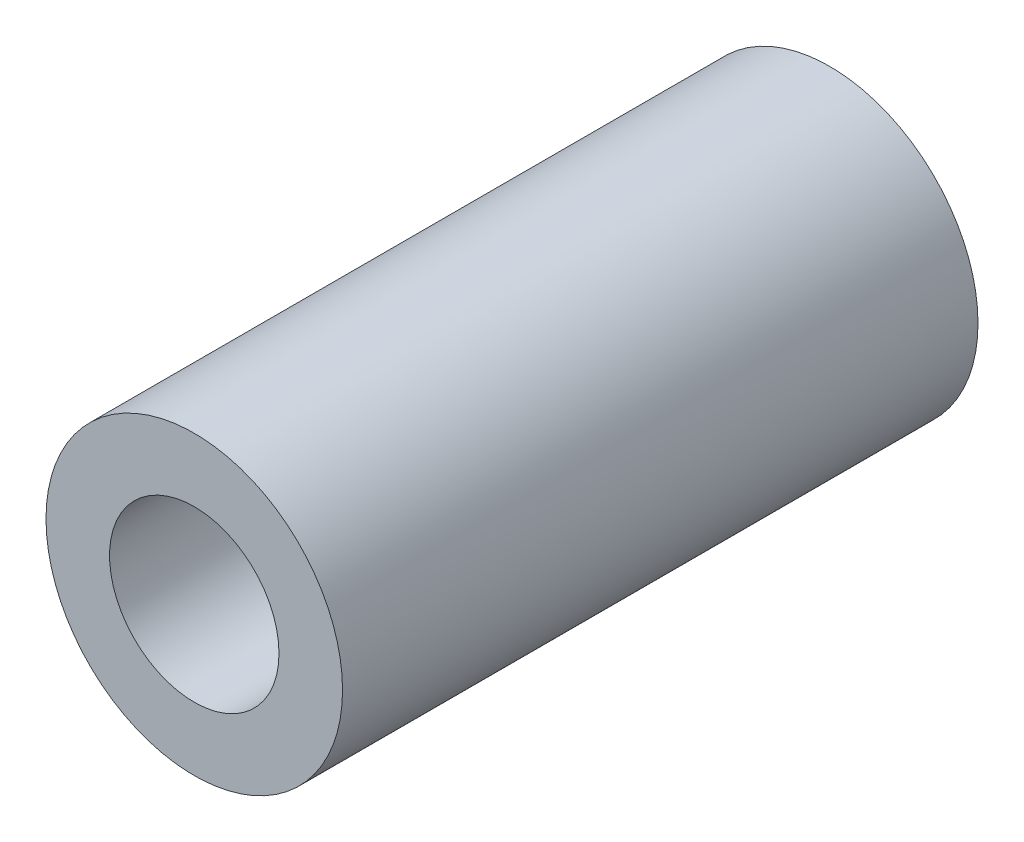
ISO-10303-21;
HEADER;
FILE_DESCRIPTION(('STEP AP214'),'2;1');
FILE_NAME('part.step','',(''),(''),'','','');
FILE_SCHEMA(('AUTOMOTIVE_DESIGN { 1 0 10303 214 1 1 1 1 }'));
ENDSEC;
DATA;
#1=APPLICATION_CONTEXT('core data for automotive mechanical design processes');
#2=APPLICATION_PROTOCOL_DEFINITION('international standard','automotive_design',2000,#1);
#3=PRODUCT_CONTEXT('',#1,'mechanical');
#4=PRODUCT('Part','Part','',(#3));
#5=PRODUCT_RELATED_PRODUCT_CATEGORY('part','',(#4));
#6=PRODUCT_DEFINITION_FORMATION('','',#4);
#7=PRODUCT_DEFINITION_CONTEXT('part definition',#1,'design');
#8=PRODUCT_DEFINITION('design','',#6,#7);
#9=PRODUCT_DEFINITION_SHAPE('','',#8);
#10=(LENGTH_UNIT() NAMED_UNIT(*) SI_UNIT(.MILLI.,.METRE.));
#11=(NAMED_UNIT(*) PLANE_ANGLE_UNIT() SI_UNIT($,.RADIAN.));
#12=(NAMED_UNIT(*) SI_UNIT($,.STERADIAN.) SOLID_ANGLE_UNIT());
#13=UNCERTAINTY_MEASURE_WITH_UNIT(LENGTH_MEASURE(1.E-05),#10,'distance_accuracy_value','');
#14=(GEOMETRIC_REPRESENTATION_CONTEXT(3) GLOBAL_UNCERTAINTY_ASSIGNED_CONTEXT((#13)) GLOBAL_UNIT_ASSIGNED_CONTEXT((#10,
#11,#12)) REPRESENTATION_CONTEXT('',''));
#15=CARTESIAN_POINT('',(0.,0.,0.));
#16=DIRECTION('',(0.,0.,1.));
#17=DIRECTION('',(1.,0.,0.));
#18=AXIS2_PLACEMENT_3D('',#15,#16,#17);
#19=CARTESIAN_POINT('',(0.,0.,2.));
#20=DIRECTION('',(0.,0.,-1.));
#21=DIRECTION('',(-1.,0.,0.));
#22=AXIS2_PLACEMENT_3D('',#19,#20,#21);
#23=CYLINDRICAL_SURFACE('',#22,2.);
#24=CARTESIAN_POINT('',(0.,0.,0.750555349946529));
#25=DIRECTION('',(0.,0.,-1.));
#26=DIRECTION('',(-1.,0.,0.));
#27=AXIS2_PLACEMENT_3D('',#24,#25,#26);
#28=CIRCLE('',#27,2.);
#29=CARTESIAN_POINT('',(-2.,0.,0.750555349946529));
#30=VERTEX_POINT('',#29);
#31=EDGE_CURVE('E11',#30,#30,#28,.F.);
#32=ORIENTED_EDGE('',*,*,#31,.T.);
#33=EDGE_LOOP('',(#32));
#34=FACE_BOUND('',#33,.T.);
#35=CARTESIAN_POINT('',(0.,0.,2.));
#36=DIRECTION('',(0.,0.,-1.));
#37=DIRECTION('',(-1.,0.,0.));
#38=AXIS2_PLACEMENT_3D('',#35,#36,#37);
#39=CIRCLE('',#38,2.);
#40=CARTESIAN_POINT('',(-2.,0.,2.));
#41=VERTEX_POINT('',#40);
#42=EDGE_CURVE('E53',#41,#41,#39,.T.);
#43=ORIENTED_EDGE('',*,*,#42,.T.);
#44=EDGE_LOOP('',(#43));
#45=FACE_BOUND('',#44,.T.);
#46=ADVANCED_FACE('F41',(#34,#45),#23,.T.);
#47=CARTESIAN_POINT('',(0.,0.,2.));
#48=DIRECTION('',(0.,0.,-1.));
#49=DIRECTION('',(-1.,0.,0.));
#50=AXIS2_PLACEMENT_3D('',#47,#48,#49);
#51=PLANE('',#50);
#52=CARTESIAN_POINT('',(0.,0.,2.));
#53=DIRECTION('',(0.,0.,-1.));
#54=DIRECTION('',(-1.,0.,0.));
#55=AXIS2_PLACEMENT_3D('',#52,#53,#54);
#56=CIRCLE('',#55,1.3);
#57=CARTESIAN_POINT('',(-1.3,0.,2.));
#58=VERTEX_POINT('',#57);
#59=EDGE_CURVE('E57',#58,#58,#56,.T.);
#60=ORIENTED_EDGE('',*,*,#59,.T.);
#61=EDGE_LOOP('',(#60));
#62=FACE_BOUND('',#61,.T.);
#63=ORIENTED_EDGE('',*,*,#42,.F.);
#64=EDGE_LOOP('',(#63));
#65=FACE_BOUND('',#64,.T.);
#66=ADVANCED_FACE('F63',(#62,#65),#51,.F.);
#67=CARTESIAN_POINT('',(0.,0.,2.));
#68=DIRECTION('',(0.,0.,-1.));
#69=DIRECTION('',(-1.,0.,0.));
#70=AXIS2_PLACEMENT_3D('',#67,#68,#69);
#71=CYLINDRICAL_SURFACE('',#70,1.3);
#72=CARTESIAN_POINT('',(0.,0.,1.15470053837927));
#73=DIRECTION('',(0.,0.,-1.));
#74=DIRECTION('',(-1.,0.,0.));
#75=AXIS2_PLACEMENT_3D('',#72,#73,#74);
#76=CIRCLE('',#75,1.3);
#77=CARTESIAN_POINT('',(-1.3,0.,1.15470053837927));
#78=VERTEX_POINT('',#77);
#79=EDGE_CURVE('E49',#78,#78,#76,.T.);
#80=ORIENTED_EDGE('',*,*,#79,.T.);
#81=EDGE_LOOP('',(#80));
#82=FACE_BOUND('',#81,.T.);
#83=ORIENTED_EDGE('',*,*,#59,.F.);
#84=EDGE_LOOP('',(#83));
#85=FACE_BOUND('',#84,.T.);
#86=ADVANCED_FACE('F66',(#82,#85),#71,.F.);
#87=CARTESIAN_POINT('',(0.,0.,1.15470053837927));
#88=DIRECTION('',(0.,0.,-1.));
#89=DIRECTION('',(-1.,0.,0.));
#90=AXIS2_PLACEMENT_3D('',#87,#88,#89);
#91=CONICAL_SURFACE('',#90,1.3,1.04719755119659);
#92=ORIENTED_EDGE('',*,*,#31,.F.);
#93=EDGE_LOOP('',(#92));
#94=FACE_BOUND('',#93,.T.);
#95=ORIENTED_EDGE('',*,*,#79,.F.);
#96=EDGE_LOOP('',(#95));
#97=FACE_BOUND('',#96,.T.);
#98=ADVANCED_FACE('F44',(#94,#97),#91,.F.);
#99=CLOSED_SHELL('',(#46,#66,#86,#98));
#100=MANIFOLD_SOLID_BREP('B2',#99);
#101=CARTESIAN_POINT('',(0.,0.,15.));
#102=DIRECTION('',(0.,0.,-1.));
#103=DIRECTION('',(-1.,0.,0.));
#104=AXIS2_PLACEMENT_3D('',#101,#102,#103);
#105=CYLINDRICAL_SURFACE('',#104,3.5);
#106=CARTESIAN_POINT('',(0.,0.,15.));
#107=DIRECTION('',(0.,0.,1.));
#108=DIRECTION('',(1.,0.,0.));
#109=AXIS2_PLACEMENT_3D('',#106,#107,#108);
#110=CIRCLE('',#109,3.5);
#111=CARTESIAN_POINT('',(3.5,0.,15.));
#112=VERTEX_POINT('',#111);
#113=EDGE_CURVE('E118',#112,#112,#110,.T.);
#114=ORIENTED_EDGE('',*,*,#113,.F.);
#115=EDGE_LOOP('',(#114));
#116=FACE_BOUND('',#115,.T.);
#117=CARTESIAN_POINT('',(0.,0.,0.));
#118=DIRECTION('',(0.,0.,1.));
#119=DIRECTION('',(1.,0.,0.));
#120=AXIS2_PLACEMENT_3D('',#117,#118,#119);
#121=CIRCLE('',#120,3.5);
#122=CARTESIAN_POINT('',(3.5,0.,0.));
#123=VERTEX_POINT('',#122);
#124=EDGE_CURVE('E122',#123,#123,#121,.T.);
#125=ORIENTED_EDGE('',*,*,#124,.T.);
#126=EDGE_LOOP('',(#125));
#127=FACE_BOUND('',#126,.T.);
#128=ADVANCED_FACE('F106',(#116,#127),#105,.T.);
#129=CARTESIAN_POINT('',(0.,0.,15.));
#130=DIRECTION('',(0.,0.,1.));
#131=DIRECTION('',(1.,0.,0.));
#132=AXIS2_PLACEMENT_3D('',#129,#130,#131);
#133=PLANE('',#132);
#134=CARTESIAN_POINT('',(0.,0.,15.));
#135=DIRECTION('',(0.,0.,1.));
#136=DIRECTION('',(1.,0.,0.));
#137=AXIS2_PLACEMENT_3D('',#134,#135,#136);
#138=CIRCLE('',#137,2.);
#139=CARTESIAN_POINT('',(2.,0.,15.));
#140=VERTEX_POINT('',#139);
#141=EDGE_CURVE('E126',#140,#140,#138,.T.);
#142=ORIENTED_EDGE('',*,*,#141,.F.);
#143=EDGE_LOOP('',(#142));
#144=FACE_BOUND('',#143,.T.);
#145=ORIENTED_EDGE('',*,*,#113,.T.);
#146=EDGE_LOOP('',(#145));
#147=FACE_BOUND('',#146,.T.);
#148=ADVANCED_FACE('F133',(#144,#147),#133,.T.);
#149=CARTESIAN_POINT('',(0.,0.,0.));
#150=DIRECTION('',(0.,0.,1.));
#151=DIRECTION('',(1.,0.,0.));
#152=AXIS2_PLACEMENT_3D('',#149,#150,#151);
#153=PLANE('',#152);
#154=CARTESIAN_POINT('',(0.,0.,0.));
#155=DIRECTION('',(0.,0.,1.));
#156=DIRECTION('',(1.,0.,0.));
#157=AXIS2_PLACEMENT_3D('',#154,#155,#156);
#158=CIRCLE('',#157,2.57735026918963);
#159=CARTESIAN_POINT('',(2.57735026918963,0.,0.));
#160=VERTEX_POINT('',#159);
#161=EDGE_CURVE('E114',#160,#160,#158,.T.);
#162=ORIENTED_EDGE('',*,*,#161,.T.);
#163=EDGE_LOOP('',(#162));
#164=FACE_BOUND('',#163,.T.);
#165=ORIENTED_EDGE('',*,*,#124,.F.);
#166=EDGE_LOOP('',(#165));
#167=FACE_BOUND('',#166,.T.);
#168=ADVANCED_FACE('F136',(#164,#167),#153,.F.);
#169=CARTESIAN_POINT('',(0.,0.,0.));
#170=DIRECTION('',(0.,0.,1.));
#171=DIRECTION('',(1.,0.,0.));
#172=AXIS2_PLACEMENT_3D('',#169,#170,#171);
#173=CYLINDRICAL_SURFACE('',#172,2.);
#174=CARTESIAN_POINT('',(0.,0.,1.00000000000001));
#175=DIRECTION('',(0.,0.,1.));
#176=DIRECTION('',(1.,0.,0.));
#177=AXIS2_PLACEMENT_3D('',#174,#175,#176);
#178=CIRCLE('',#177,2.);
#179=CARTESIAN_POINT('',(2.,0.,1.00000000000001));
#180=VERTEX_POINT('',#179);
#181=EDGE_CURVE('E40',#180,#180,#178,.F.);
#182=ORIENTED_EDGE('',*,*,#181,.T.);
#183=EDGE_LOOP('',(#182));
#184=FACE_BOUND('',#183,.T.);
#185=ORIENTED_EDGE('',*,*,#141,.T.);
#186=EDGE_LOOP('',(#185));
#187=FACE_BOUND('',#186,.T.);
#188=ADVANCED_FACE('F131',(#184,#187),#173,.F.);
#189=CARTESIAN_POINT('',(0.,0.,0.));
#190=DIRECTION('',(0.,0.,-1.));
#191=DIRECTION('',(-1.,0.,0.));
#192=AXIS2_PLACEMENT_3D('',#189,#190,#191);
#193=CONICAL_SURFACE('',#192,2.57735026918963,0.523598775598297);
#194=ORIENTED_EDGE('',*,*,#181,.F.);
#195=EDGE_LOOP('',(#194));
#196=FACE_BOUND('',#195,.T.);
#197=ORIENTED_EDGE('',*,*,#161,.F.);
#198=EDGE_LOOP('',(#197));
#199=FACE_BOUND('',#198,.T.);
#200=ADVANCED_FACE('F109',(#196,#199),#193,.F.);
#201=CLOSED_SHELL('',(#128,#148,#168,#188,#200));
#202=MANIFOLD_SOLID_BREP('B6',#201);
#203=ADVANCED_BREP_SHAPE_REPRESENTATION('',(#18,#100,#202),#14);
#204=SHAPE_DEFINITION_REPRESENTATION(#9,#203);
ENDSEC;
END-ISO-10303-21;
